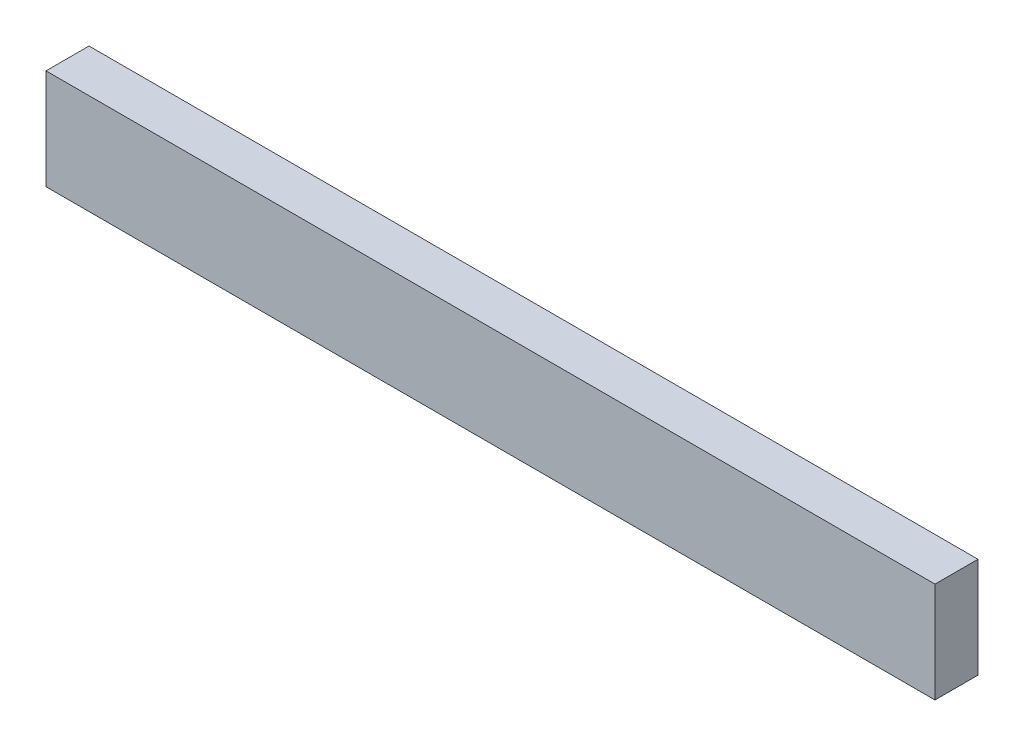
ISO-10303-21;
HEADER;
FILE_DESCRIPTION(('STEP AP214'),'2;1');
FILE_NAME('part.step','',(''),(''),'','','');
FILE_SCHEMA(('AUTOMOTIVE_DESIGN { 1 0 10303 214 1 1 1 1 }'));
ENDSEC;
DATA;
#1=APPLICATION_CONTEXT('core data for automotive mechanical design processes');
#2=APPLICATION_PROTOCOL_DEFINITION('international standard','automotive_design',2000,#1);
#3=PRODUCT_CONTEXT('',#1,'mechanical');
#4=PRODUCT('Part','Part','',(#3));
#5=PRODUCT_RELATED_PRODUCT_CATEGORY('part','',(#4));
#6=PRODUCT_DEFINITION_FORMATION('','',#4);
#7=PRODUCT_DEFINITION_CONTEXT('part definition',#1,'design');
#8=PRODUCT_DEFINITION('design','',#6,#7);
#9=PRODUCT_DEFINITION_SHAPE('','',#8);
#10=(LENGTH_UNIT() NAMED_UNIT(*) SI_UNIT(.MILLI.,.METRE.));
#11=(NAMED_UNIT(*) PLANE_ANGLE_UNIT() SI_UNIT($,.RADIAN.));
#12=(NAMED_UNIT(*) SI_UNIT($,.STERADIAN.) SOLID_ANGLE_UNIT());
#13=UNCERTAINTY_MEASURE_WITH_UNIT(LENGTH_MEASURE(1.E-05),#10,'distance_accuracy_value','');
#14=(GEOMETRIC_REPRESENTATION_CONTEXT(3) GLOBAL_UNCERTAINTY_ASSIGNED_CONTEXT((#13)) GLOBAL_UNIT_ASSIGNED_CONTEXT((#10,
#11,#12)) REPRESENTATION_CONTEXT('',''));
#15=CARTESIAN_POINT('',(0.,0.,0.));
#16=DIRECTION('',(0.,0.,1.));
#17=DIRECTION('',(1.,0.,0.));
#18=AXIS2_PLACEMENT_3D('',#15,#16,#17);
#19=CARTESIAN_POINT('',(787.4,-44.45,-19.05));
#20=DIRECTION('',(0.,0.,1.));
#21=DIRECTION('',(1.,0.,0.));
#22=AXIS2_PLACEMENT_3D('',#19,#20,#21);
#23=PLANE('',#22);
#24=DIRECTION('',(0.,1.,0.));
#25=VECTOR('',#24,1.);
#26=CARTESIAN_POINT('',(0.,-44.45,-19.05));
#27=LINE('',#26,#25);
#28=CARTESIAN_POINT('',(0.,-44.45,-19.05));
#29=VERTEX_POINT('',#28);
#30=CARTESIAN_POINT('',(0.,44.45,-19.05));
#31=VERTEX_POINT('',#30);
#32=EDGE_CURVE('E107',#29,#31,#27,.T.);
#33=ORIENTED_EDGE('',*,*,#32,.T.);
#34=DIRECTION('',(-1.,0.,0.));
#35=VECTOR('',#34,1.);
#36=CARTESIAN_POINT('',(787.4,44.45,-19.05));
#37=LINE('',#36,#35);
#38=CARTESIAN_POINT('',(787.4,44.45,-19.05));
#39=VERTEX_POINT('',#38);
#40=EDGE_CURVE('E11',#39,#31,#37,.T.);
#41=ORIENTED_EDGE('',*,*,#40,.F.);
#42=DIRECTION('',(0.,1.,0.));
#43=VECTOR('',#42,1.);
#44=CARTESIAN_POINT('',(787.4,-44.45,-19.05));
#45=LINE('',#44,#43);
#46=CARTESIAN_POINT('',(787.4,-44.45,-19.05));
#47=VERTEX_POINT('',#46);
#48=EDGE_CURVE('E90',#47,#39,#45,.T.);
#49=ORIENTED_EDGE('',*,*,#48,.F.);
#50=DIRECTION('',(-1.,0.,0.));
#51=VECTOR('',#50,1.);
#52=CARTESIAN_POINT('',(787.4,-44.45,-19.05));
#53=LINE('',#52,#51);
#54=EDGE_CURVE('E103',#47,#29,#53,.T.);
#55=ORIENTED_EDGE('',*,*,#54,.T.);
#56=EDGE_LOOP('',(#33,#41,#49,#55));
#57=FACE_BOUND('',#56,.T.);
#58=ADVANCED_FACE('F38',(#57),#23,.F.);
#59=CARTESIAN_POINT('',(787.4,44.45,19.05));
#60=DIRECTION('',(0.,-1.,0.));
#61=DIRECTION('',(0.,0.,-1.));
#62=AXIS2_PLACEMENT_3D('',#59,#60,#61);
#63=PLANE('',#62);
#64=DIRECTION('',(0.,0.,1.));
#65=VECTOR('',#64,1.);
#66=CARTESIAN_POINT('',(0.,44.45,19.05));
#67=LINE('',#66,#65);
#68=CARTESIAN_POINT('',(0.,44.45,19.05));
#69=VERTEX_POINT('',#68);
#70=EDGE_CURVE('E95',#31,#69,#67,.T.);
#71=ORIENTED_EDGE('',*,*,#70,.T.);
#72=DIRECTION('',(-1.,0.,0.));
#73=VECTOR('',#72,1.);
#74=CARTESIAN_POINT('',(787.4,44.45,19.05));
#75=LINE('',#74,#73);
#76=CARTESIAN_POINT('',(787.4,44.45,19.05));
#77=VERTEX_POINT('',#76);
#78=EDGE_CURVE('E47',#77,#69,#75,.T.);
#79=ORIENTED_EDGE('',*,*,#78,.F.);
#80=DIRECTION('',(0.,0.,1.));
#81=VECTOR('',#80,1.);
#82=CARTESIAN_POINT('',(787.4,44.45,19.05));
#83=LINE('',#82,#81);
#84=EDGE_CURVE('E85',#39,#77,#83,.T.);
#85=ORIENTED_EDGE('',*,*,#84,.F.);
#86=ORIENTED_EDGE('',*,*,#40,.T.);
#87=EDGE_LOOP('',(#71,#79,#85,#86));
#88=FACE_BOUND('',#87,.T.);
#89=ADVANCED_FACE('F94',(#88),#63,.F.);
#90=CARTESIAN_POINT('',(787.4,-44.45,19.05));
#91=DIRECTION('',(0.,0.,-1.));
#92=DIRECTION('',(-1.,0.,0.));
#93=AXIS2_PLACEMENT_3D('',#90,#91,#92);
#94=PLANE('',#93);
#95=DIRECTION('',(0.,-1.,0.));
#96=VECTOR('',#95,1.);
#97=CARTESIAN_POINT('',(0.,-44.45,19.05));
#98=LINE('',#97,#96);
#99=CARTESIAN_POINT('',(0.,-44.45,19.05));
#100=VERTEX_POINT('',#99);
#101=EDGE_CURVE('E72',#69,#100,#98,.T.);
#102=ORIENTED_EDGE('',*,*,#101,.T.);
#103=DIRECTION('',(-1.,0.,0.));
#104=VECTOR('',#103,1.);
#105=CARTESIAN_POINT('',(787.4,-44.45,19.05));
#106=LINE('',#105,#104);
#107=CARTESIAN_POINT('',(787.4,-44.45,19.05));
#108=VERTEX_POINT('',#107);
#109=EDGE_CURVE('E97',#108,#100,#106,.T.);
#110=ORIENTED_EDGE('',*,*,#109,.F.);
#111=DIRECTION('',(0.,-1.,0.));
#112=VECTOR('',#111,1.);
#113=CARTESIAN_POINT('',(787.4,-44.45,19.05));
#114=LINE('',#113,#112);
#115=EDGE_CURVE('E88',#77,#108,#114,.T.);
#116=ORIENTED_EDGE('',*,*,#115,.F.);
#117=ORIENTED_EDGE('',*,*,#78,.T.);
#118=EDGE_LOOP('',(#102,#110,#116,#117));
#119=FACE_BOUND('',#118,.T.);
#120=ADVANCED_FACE('F98',(#119),#94,.F.);
#121=CARTESIAN_POINT('',(787.4,-44.45,19.05));
#122=DIRECTION('',(0.,1.,0.));
#123=DIRECTION('',(0.,0.,1.));
#124=AXIS2_PLACEMENT_3D('',#121,#122,#123);
#125=PLANE('',#124);
#126=DIRECTION('',(0.,0.,-1.));
#127=VECTOR('',#126,1.);
#128=CARTESIAN_POINT('',(0.,-44.45,19.05));
#129=LINE('',#128,#127);
#130=EDGE_CURVE('E78',#100,#29,#129,.T.);
#131=ORIENTED_EDGE('',*,*,#130,.T.);
#132=ORIENTED_EDGE('',*,*,#54,.F.);
#133=DIRECTION('',(0.,0.,-1.));
#134=VECTOR('',#133,1.);
#135=CARTESIAN_POINT('',(787.4,-44.45,19.05));
#136=LINE('',#135,#134);
#137=EDGE_CURVE('E55',#108,#47,#136,.T.);
#138=ORIENTED_EDGE('',*,*,#137,.F.);
#139=ORIENTED_EDGE('',*,*,#109,.T.);
#140=EDGE_LOOP('',(#131,#132,#138,#139));
#141=FACE_BOUND('',#140,.T.);
#142=ADVANCED_FACE('F121',(#141),#125,.F.);
#143=CARTESIAN_POINT('',(787.4,0.,0.));
#144=DIRECTION('',(-1.,0.,0.));
#145=DIRECTION('',(0.,0.,1.));
#146=AXIS2_PLACEMENT_3D('',#143,#144,#145);
#147=PLANE('',#146);
#148=ORIENTED_EDGE('',*,*,#48,.T.);
#149=ORIENTED_EDGE('',*,*,#84,.T.);
#150=ORIENTED_EDGE('',*,*,#115,.T.);
#151=ORIENTED_EDGE('',*,*,#137,.T.);
#152=EDGE_LOOP('',(#148,#149,#150,#151));
#153=FACE_BOUND('',#152,.T.);
#154=ADVANCED_FACE('F86',(#153),#147,.F.);
#155=CARTESIAN_POINT('',(0.,0.,0.));
#156=DIRECTION('',(-1.,0.,0.));
#157=DIRECTION('',(0.,0.,1.));
#158=AXIS2_PLACEMENT_3D('',#155,#156,#157);
#159=PLANE('',#158);
#160=ORIENTED_EDGE('',*,*,#32,.F.);
#161=ORIENTED_EDGE('',*,*,#130,.F.);
#162=ORIENTED_EDGE('',*,*,#101,.F.);
#163=ORIENTED_EDGE('',*,*,#70,.F.);
#164=EDGE_LOOP('',(#160,#161,#162,#163));
#165=FACE_BOUND('',#164,.T.);
#166=ADVANCED_FACE('F124',(#165),#159,.T.);
#167=CLOSED_SHELL('',(#58,#89,#120,#142,#154,#166));
#168=MANIFOLD_SOLID_BREP('B2',#167);
#169=ADVANCED_BREP_SHAPE_REPRESENTATION('',(#18,#168),#14);
#170=SHAPE_DEFINITION_REPRESENTATION(#9,#169);
ENDSEC;
END-ISO-10303-21;
